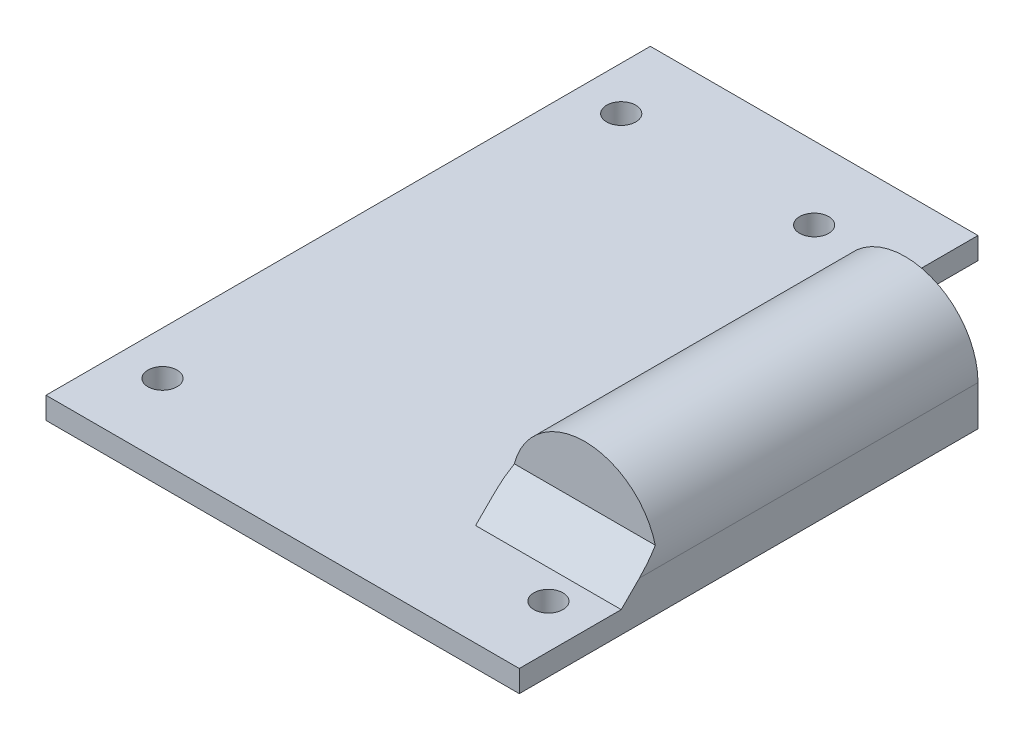
ISO-10303-21;
HEADER;
FILE_DESCRIPTION(('STEP AP214'),'2;1');
FILE_NAME('part.step','',(''),(''),'','','');
FILE_SCHEMA(('AUTOMOTIVE_DESIGN { 1 0 10303 214 1 1 1 1 }'));
ENDSEC;
DATA;
#1=APPLICATION_CONTEXT('core data for automotive mechanical design processes');
#2=APPLICATION_PROTOCOL_DEFINITION('international standard','automotive_design',2000,#1);
#3=PRODUCT_CONTEXT('',#1,'mechanical');
#4=PRODUCT('Part','Part','',(#3));
#5=PRODUCT_RELATED_PRODUCT_CATEGORY('part','',(#4));
#6=PRODUCT_DEFINITION_FORMATION('','',#4);
#7=PRODUCT_DEFINITION_CONTEXT('part definition',#1,'design');
#8=PRODUCT_DEFINITION('design','',#6,#7);
#9=PRODUCT_DEFINITION_SHAPE('','',#8);
#10=(LENGTH_UNIT() NAMED_UNIT(*) SI_UNIT(.MILLI.,.METRE.));
#11=(NAMED_UNIT(*) PLANE_ANGLE_UNIT() SI_UNIT($,.RADIAN.));
#12=(NAMED_UNIT(*) SI_UNIT($,.STERADIAN.) SOLID_ANGLE_UNIT());
#13=UNCERTAINTY_MEASURE_WITH_UNIT(LENGTH_MEASURE(1.E-05),#10,'distance_accuracy_value','');
#14=(GEOMETRIC_REPRESENTATION_CONTEXT(3) GLOBAL_UNCERTAINTY_ASSIGNED_CONTEXT((#13)) GLOBAL_UNIT_ASSIGNED_CONTEXT((#10,
#11,#12)) REPRESENTATION_CONTEXT('',''));
#15=CARTESIAN_POINT('',(0.,0.,0.));
#16=DIRECTION('',(0.,0.,1.));
#17=DIRECTION('',(1.,0.,0.));
#18=AXIS2_PLACEMENT_3D('',#15,#16,#17);
#19=CARTESIAN_POINT('',(55.,5.5,103.));
#20=DIRECTION('',(0.,0.,-1.));
#21=DIRECTION('',(1.,0.,0.));
#22=AXIS2_PLACEMENT_3D('',#19,#20,#21);
#23=CYLINDRICAL_SURFACE('',#22,4.05);
#24=DIRECTION('',(0.,0.,-1.));
#25=VECTOR('',#24,1.);
#26=CARTESIAN_POINT('',(59.05,5.5,112.790812019439));
#27=LINE('',#26,#25);
#28=CARTESIAN_POINT('',(59.05,5.5,103.));
#29=VERTEX_POINT('',#28);
#30=CARTESIAN_POINT('',(59.05,5.5,63.));
#31=VERTEX_POINT('',#30);
#32=EDGE_CURVE('E462',#29,#31,#27,.T.);
#33=ORIENTED_EDGE('',*,*,#32,.F.);
#34=CARTESIAN_POINT('',(55.,5.5,103.));
#35=DIRECTION('',(0.,0.,1.));
#36=DIRECTION('',(1.,0.,0.));
#37=AXIS2_PLACEMENT_3D('',#34,#35,#36);
#38=CIRCLE('',#37,4.05);
#39=CARTESIAN_POINT('',(50.95,5.5,103.));
#40=VERTEX_POINT('',#39);
#41=EDGE_CURVE('E152',#29,#40,#38,.T.);
#42=ORIENTED_EDGE('',*,*,#41,.T.);
#43=DIRECTION('',(0.,0.,-1.));
#44=VECTOR('',#43,1.);
#45=CARTESIAN_POINT('',(50.95,5.5,112.790812019439));
#46=LINE('',#45,#44);
#47=CARTESIAN_POINT('',(50.95,5.5,63.));
#48=VERTEX_POINT('',#47);
#49=EDGE_CURVE('E137',#40,#48,#46,.T.);
#50=ORIENTED_EDGE('',*,*,#49,.T.);
#51=CARTESIAN_POINT('',(55.,5.5,63.));
#52=DIRECTION('',(0.,0.,1.));
#53=DIRECTION('',(1.,0.,0.));
#54=AXIS2_PLACEMENT_3D('',#51,#52,#53);
#55=CIRCLE('',#54,4.05);
#56=EDGE_CURVE('E146',#31,#48,#55,.T.);
#57=ORIENTED_EDGE('',*,*,#56,.F.);
#58=EDGE_LOOP('',(#33,#42,#50,#57));
#59=FACE_BOUND('',#58,.T.);
#60=ADVANCED_FACE('F35',(#59),#23,.F.);
#61=CARTESIAN_POINT('',(0.,3.,126.));
#62=DIRECTION('',(1.,0.,0.));
#63=DIRECTION('',(0.,0.,1.));
#64=AXIS2_PLACEMENT_3D('',#61,#62,#63);
#65=PLANE('',#64);
#66=DIRECTION('',(0.,0.,-1.));
#67=VECTOR('',#66,1.);
#68=CARTESIAN_POINT('',(0.,0.,126.));
#69=LINE('',#68,#67);
#70=CARTESIAN_POINT('',(0.,0.,126.));
#71=VERTEX_POINT('',#70);
#72=CARTESIAN_POINT('',(0.,0.,43.));
#73=VERTEX_POINT('',#72);
#74=EDGE_CURVE('E208',#71,#73,#69,.T.);
#75=ORIENTED_EDGE('',*,*,#74,.F.);
#76=DIRECTION('',(0.,-1.,0.));
#77=VECTOR('',#76,1.);
#78=CARTESIAN_POINT('',(0.,3.,126.));
#79=LINE('',#78,#77);
#80=CARTESIAN_POINT('',(0.,3.,126.));
#81=VERTEX_POINT('',#80);
#82=EDGE_CURVE('E207',#81,#71,#79,.T.);
#83=ORIENTED_EDGE('',*,*,#82,.F.);
#84=DIRECTION('',(0.,0.,-1.));
#85=VECTOR('',#84,1.);
#86=CARTESIAN_POINT('',(0.,3.,126.));
#87=LINE('',#86,#85);
#88=CARTESIAN_POINT('',(0.,3.,43.));
#89=VERTEX_POINT('',#88);
#90=EDGE_CURVE('E192',#81,#89,#87,.T.);
#91=ORIENTED_EDGE('',*,*,#90,.T.);
#92=DIRECTION('',(0.,-1.,0.));
#93=VECTOR('',#92,1.);
#94=CARTESIAN_POINT('',(0.,3.,43.));
#95=LINE('',#94,#93);
#96=EDGE_CURVE('E238',#89,#73,#95,.T.);
#97=ORIENTED_EDGE('',*,*,#96,.T.);
#98=EDGE_LOOP('',(#75,#83,#91,#97));
#99=FACE_BOUND('',#98,.T.);
#100=ADVANCED_FACE('F290',(#99),#65,.F.);
#101=CARTESIAN_POINT('',(0.,3.,43.));
#102=DIRECTION('',(0.,0.,1.));
#103=DIRECTION('',(-1.,0.,0.));
#104=AXIS2_PLACEMENT_3D('',#101,#102,#103);
#105=PLANE('',#104);
#106=DIRECTION('',(1.,0.,0.));
#107=VECTOR('',#106,1.);
#108=CARTESIAN_POINT('',(0.,0.,43.));
#109=LINE('',#108,#107);
#110=CARTESIAN_POINT('',(45.,0.,43.));
#111=VERTEX_POINT('',#110);
#112=EDGE_CURVE('E211',#73,#111,#109,.T.);
#113=ORIENTED_EDGE('',*,*,#112,.F.);
#114=ORIENTED_EDGE('',*,*,#96,.F.);
#115=DIRECTION('',(1.,0.,0.));
#116=VECTOR('',#115,1.);
#117=CARTESIAN_POINT('',(0.,3.,43.));
#118=LINE('',#117,#116);
#119=CARTESIAN_POINT('',(45.,3.,43.));
#120=VERTEX_POINT('',#119);
#121=EDGE_CURVE('E195',#89,#120,#118,.T.);
#122=ORIENTED_EDGE('',*,*,#121,.T.);
#123=DIRECTION('',(0.,-1.,0.));
#124=VECTOR('',#123,1.);
#125=CARTESIAN_POINT('',(45.,3.,43.));
#126=LINE('',#125,#124);
#127=EDGE_CURVE('E235',#120,#111,#126,.T.);
#128=ORIENTED_EDGE('',*,*,#127,.T.);
#129=EDGE_LOOP('',(#113,#114,#122,#128));
#130=FACE_BOUND('',#129,.T.);
#131=ADVANCED_FACE('F294',(#130),#105,.F.);
#132=CARTESIAN_POINT('',(45.,3.,43.));
#133=DIRECTION('',(-1.,0.,0.));
#134=DIRECTION('',(0.,0.,-1.));
#135=AXIS2_PLACEMENT_3D('',#132,#133,#134);
#136=PLANE('',#135);
#137=DIRECTION('',(0.,0.,1.));
#138=VECTOR('',#137,1.);
#139=CARTESIAN_POINT('',(45.,0.,43.));
#140=LINE('',#139,#138);
#141=CARTESIAN_POINT('',(45.,0.,63.));
#142=VERTEX_POINT('',#141);
#143=EDGE_CURVE('E214',#111,#142,#140,.T.);
#144=ORIENTED_EDGE('',*,*,#143,.F.);
#145=ORIENTED_EDGE('',*,*,#127,.F.);
#146=DIRECTION('',(0.,0.,1.));
#147=VECTOR('',#146,1.);
#148=CARTESIAN_POINT('',(45.,3.,43.));
#149=LINE('',#148,#147);
#150=CARTESIAN_POINT('',(45.,3.,63.));
#151=VERTEX_POINT('',#150);
#152=EDGE_CURVE('E199',#120,#151,#149,.T.);
#153=ORIENTED_EDGE('',*,*,#152,.T.);
#154=DIRECTION('',(0.,-1.,0.));
#155=VECTOR('',#154,1.);
#156=CARTESIAN_POINT('',(45.,3.,63.));
#157=LINE('',#156,#155);
#158=EDGE_CURVE('E232',#151,#142,#157,.T.);
#159=ORIENTED_EDGE('',*,*,#158,.T.);
#160=EDGE_LOOP('',(#144,#145,#153,#159));
#161=FACE_BOUND('',#160,.T.);
#162=ADVANCED_FACE('F417',(#161),#136,.F.);
#163=CARTESIAN_POINT('',(45.,3.,63.));
#164=DIRECTION('',(0.,0.,1.));
#165=DIRECTION('',(-1.,0.,0.));
#166=AXIS2_PLACEMENT_3D('',#163,#164,#165);
#167=PLANE('',#166);
#168=ORIENTED_EDGE('',*,*,#56,.T.);
#169=DIRECTION('',(0.,-1.,0.));
#170=VECTOR('',#169,1.);
#171=CARTESIAN_POINT('',(50.95,5.5,63.));
#172=LINE('',#171,#170);
#173=CARTESIAN_POINT('',(50.95,0.,63.));
#174=VERTEX_POINT('',#173);
#175=EDGE_CURVE('E133',#48,#174,#172,.T.);
#176=ORIENTED_EDGE('',*,*,#175,.T.);
#177=DIRECTION('',(1.,0.,0.));
#178=VECTOR('',#177,1.);
#179=CARTESIAN_POINT('',(45.,0.,63.));
#180=LINE('',#179,#178);
#181=EDGE_CURVE('E218',#142,#174,#180,.T.);
#182=ORIENTED_EDGE('',*,*,#181,.F.);
#183=ORIENTED_EDGE('',*,*,#158,.F.);
#184=DIRECTION('',(0.,1.,0.));
#185=VECTOR('',#184,1.);
#186=CARTESIAN_POINT('',(45.,0.,63.));
#187=LINE('',#186,#185);
#188=CARTESIAN_POINT('',(45.,5.5,63.));
#189=VERTEX_POINT('',#188);
#190=EDGE_CURVE('E167',#151,#189,#187,.T.);
#191=ORIENTED_EDGE('',*,*,#190,.T.);
#192=CARTESIAN_POINT('',(55.,5.5,63.));
#193=DIRECTION('',(0.,0.,1.));
#194=DIRECTION('',(1.,0.,0.));
#195=AXIS2_PLACEMENT_3D('',#192,#193,#194);
#196=CIRCLE('',#195,9.99999999999999);
#197=CARTESIAN_POINT('',(65.,5.5,63.));
#198=VERTEX_POINT('',#197);
#199=EDGE_CURVE('E162',#189,#198,#196,.F.);
#200=ORIENTED_EDGE('',*,*,#199,.T.);
#201=DIRECTION('',(0.,-1.,0.));
#202=VECTOR('',#201,1.);
#203=CARTESIAN_POINT('',(65.,3.,63.));
#204=LINE('',#203,#202);
#205=CARTESIAN_POINT('',(65.,0.,63.));
#206=VERTEX_POINT('',#205);
#207=EDGE_CURVE('E229',#198,#206,#204,.T.);
#208=ORIENTED_EDGE('',*,*,#207,.T.);
#209=CARTESIAN_POINT('',(59.05,0.,63.));
#210=VERTEX_POINT('',#209);
#211=EDGE_CURVE('E217',#210,#206,#180,.T.);
#212=ORIENTED_EDGE('',*,*,#211,.F.);
#213=DIRECTION('',(0.,1.,0.));
#214=VECTOR('',#213,1.);
#215=CARTESIAN_POINT('',(59.05,0.,63.));
#216=LINE('',#215,#214);
#217=EDGE_CURVE('E143',#210,#31,#216,.T.);
#218=ORIENTED_EDGE('',*,*,#217,.T.);
#219=EDGE_LOOP('',(#168,#176,#182,#183,#191,#200,#208,#212,#218));
#220=FACE_BOUND('',#219,.T.);
#221=ADVANCED_FACE('F147',(#220),#167,.F.);
#222=CARTESIAN_POINT('',(65.,3.,126.));
#223=DIRECTION('',(-1.,0.,0.));
#224=DIRECTION('',(0.,0.,-1.));
#225=AXIS2_PLACEMENT_3D('',#222,#223,#224);
#226=PLANE('',#225);
#227=DIRECTION('',(0.,0.,1.));
#228=VECTOR('',#227,1.);
#229=CARTESIAN_POINT('',(65.,0.,126.));
#230=LINE('',#229,#228);
#231=CARTESIAN_POINT('',(65.,0.,126.));
#232=VERTEX_POINT('',#231);
#233=EDGE_CURVE('E220',#206,#232,#230,.T.);
#234=ORIENTED_EDGE('',*,*,#233,.F.);
#235=ORIENTED_EDGE('',*,*,#207,.F.);
#236=DIRECTION('',(0.,0.,-1.));
#237=VECTOR('',#236,1.);
#238=CARTESIAN_POINT('',(65.,5.5,107.));
#239=LINE('',#238,#237);
#240=CARTESIAN_POINT('',(65.,5.5,109.5));
#241=VERTEX_POINT('',#240);
#242=EDGE_CURVE('E172',#241,#198,#239,.T.);
#243=ORIENTED_EDGE('',*,*,#242,.F.);
#244=DIRECTION('',(0.,0.707106781186551,-0.707106781186544));
#245=VECTOR('',#244,1.);
#246=CARTESIAN_POINT('',(65.,-4.00000000000001,119.));
#247=LINE('',#246,#245);
#248=CARTESIAN_POINT('',(65.,3.,112.));
#249=VERTEX_POINT('',#248);
#250=EDGE_CURVE('E43',#249,#241,#247,.T.);
#251=ORIENTED_EDGE('',*,*,#250,.F.);
#252=DIRECTION('',(0.,0.,1.));
#253=VECTOR('',#252,1.);
#254=CARTESIAN_POINT('',(65.,3.,126.));
#255=LINE('',#254,#253);
#256=CARTESIAN_POINT('',(65.,3.,126.));
#257=VERTEX_POINT('',#256);
#258=EDGE_CURVE('E202',#249,#257,#255,.T.);
#259=ORIENTED_EDGE('',*,*,#258,.T.);
#260=DIRECTION('',(0.,-1.,0.));
#261=VECTOR('',#260,1.);
#262=CARTESIAN_POINT('',(65.,3.,126.));
#263=LINE('',#262,#261);
#264=EDGE_CURVE('E226',#257,#232,#263,.T.);
#265=ORIENTED_EDGE('',*,*,#264,.T.);
#266=EDGE_LOOP('',(#234,#235,#243,#251,#259,#265));
#267=FACE_BOUND('',#266,.T.);
#268=ADVANCED_FACE('F265',(#267),#226,.F.);
#269=CARTESIAN_POINT('',(0.,3.,126.));
#270=DIRECTION('',(0.,0.,-1.));
#271=DIRECTION('',(1.,0.,0.));
#272=AXIS2_PLACEMENT_3D('',#269,#270,#271);
#273=PLANE('',#272);
#274=DIRECTION('',(-1.,0.,0.));
#275=VECTOR('',#274,1.);
#276=CARTESIAN_POINT('',(0.,0.,126.));
#277=LINE('',#276,#275);
#278=EDGE_CURVE('E196',#232,#71,#277,.T.);
#279=ORIENTED_EDGE('',*,*,#278,.F.);
#280=ORIENTED_EDGE('',*,*,#264,.F.);
#281=DIRECTION('',(-1.,0.,0.));
#282=VECTOR('',#281,1.);
#283=CARTESIAN_POINT('',(0.,3.,126.));
#284=LINE('',#283,#282);
#285=EDGE_CURVE('E205',#257,#81,#284,.T.);
#286=ORIENTED_EDGE('',*,*,#285,.T.);
#287=ORIENTED_EDGE('',*,*,#82,.T.);
#288=EDGE_LOOP('',(#279,#280,#286,#287));
#289=FACE_BOUND('',#288,.T.);
#290=ADVANCED_FACE('F389',(#289),#273,.F.);
#291=CARTESIAN_POINT('',(0.,3.,126.));
#292=DIRECTION('',(0.,1.,0.));
#293=DIRECTION('',(0.,0.,-1.));
#294=AXIS2_PLACEMENT_3D('',#291,#292,#293);
#295=PLANE('',#294);
#296=DIRECTION('',(0.,0.,-1.));
#297=VECTOR('',#296,1.);
#298=CARTESIAN_POINT('',(45.,3.,107.));
#299=LINE('',#298,#297);
#300=CARTESIAN_POINT('',(45.,3.,112.));
#301=VERTEX_POINT('',#300);
#302=EDGE_CURVE('E175',#301,#151,#299,.T.);
#303=ORIENTED_EDGE('',*,*,#302,.T.);
#304=ORIENTED_EDGE('',*,*,#152,.F.);
#305=ORIENTED_EDGE('',*,*,#121,.F.);
#306=ORIENTED_EDGE('',*,*,#90,.F.);
#307=ORIENTED_EDGE('',*,*,#285,.F.);
#308=ORIENTED_EDGE('',*,*,#258,.F.);
#309=DIRECTION('',(1.,0.,0.));
#310=VECTOR('',#309,1.);
#311=CARTESIAN_POINT('',(0.,3.,112.));
#312=LINE('',#311,#310);
#313=EDGE_CURVE('E252',#301,#249,#312,.T.);
#314=ORIENTED_EDGE('',*,*,#313,.F.);
#315=EDGE_LOOP('',(#303,#304,#305,#306,#307,#308,#314));
#316=FACE_BOUND('',#315,.T.);
#317=CARTESIAN_POINT('',(59.,3.,116.));
#318=DIRECTION('',(0.,-1.,0.));
#319=DIRECTION('',(0.,0.,-1.));
#320=AXIS2_PLACEMENT_3D('',#317,#318,#319);
#321=CIRCLE('',#320,2.);
#322=CARTESIAN_POINT('',(59.,3.,114.));
#323=VERTEX_POINT('',#322);
#324=EDGE_CURVE('E178',#323,#323,#321,.T.);
#325=ORIENTED_EDGE('',*,*,#324,.T.);
#326=EDGE_LOOP('',(#325));
#327=FACE_BOUND('',#326,.T.);
#328=CARTESIAN_POINT('',(6.,3.,53.));
#329=DIRECTION('',(0.,-1.,0.));
#330=DIRECTION('',(0.,0.,-1.));
#331=AXIS2_PLACEMENT_3D('',#328,#329,#330);
#332=CIRCLE('',#331,2.);
#333=CARTESIAN_POINT('',(6.,3.,51.));
#334=VERTEX_POINT('',#333);
#335=EDGE_CURVE('E182',#334,#334,#332,.T.);
#336=ORIENTED_EDGE('',*,*,#335,.T.);
#337=EDGE_LOOP('',(#336));
#338=FACE_BOUND('',#337,.T.);
#339=CARTESIAN_POINT('',(32.5,3.,53.));
#340=DIRECTION('',(0.,-1.,0.));
#341=DIRECTION('',(0.,0.,-1.));
#342=AXIS2_PLACEMENT_3D('',#339,#340,#341);
#343=CIRCLE('',#342,2.);
#344=CARTESIAN_POINT('',(32.5,3.,51.));
#345=VERTEX_POINT('',#344);
#346=EDGE_CURVE('E174',#345,#345,#343,.T.);
#347=ORIENTED_EDGE('',*,*,#346,.T.);
#348=EDGE_LOOP('',(#347));
#349=FACE_BOUND('',#348,.T.);
#350=CARTESIAN_POINT('',(6.,3.,116.));
#351=DIRECTION('',(0.,-1.,0.));
#352=DIRECTION('',(0.,0.,-1.));
#353=AXIS2_PLACEMENT_3D('',#350,#351,#352);
#354=CIRCLE('',#353,2.);
#355=CARTESIAN_POINT('',(6.,3.,114.));
#356=VERTEX_POINT('',#355);
#357=EDGE_CURVE('E187',#356,#356,#354,.T.);
#358=ORIENTED_EDGE('',*,*,#357,.T.);
#359=EDGE_LOOP('',(#358));
#360=FACE_BOUND('',#359,.T.);
#361=ADVANCED_FACE('F379',(#316,#327,#338,#349,#360),#295,.T.);
#362=CARTESIAN_POINT('',(0.,0.,126.));
#363=DIRECTION('',(0.,1.,0.));
#364=DIRECTION('',(0.,0.,-1.));
#365=AXIS2_PLACEMENT_3D('',#362,#363,#364);
#366=PLANE('',#365);
#367=ORIENTED_EDGE('',*,*,#211,.T.);
#368=ORIENTED_EDGE('',*,*,#233,.T.);
#369=ORIENTED_EDGE('',*,*,#278,.T.);
#370=ORIENTED_EDGE('',*,*,#74,.T.);
#371=ORIENTED_EDGE('',*,*,#112,.T.);
#372=ORIENTED_EDGE('',*,*,#143,.T.);
#373=ORIENTED_EDGE('',*,*,#181,.T.);
#374=DIRECTION('',(0.,0.,-1.));
#375=VECTOR('',#374,1.);
#376=CARTESIAN_POINT('',(50.95,0.,112.790812019439));
#377=LINE('',#376,#375);
#378=CARTESIAN_POINT('',(50.95,0.,103.));
#379=VERTEX_POINT('',#378);
#380=EDGE_CURVE('E140',#379,#174,#377,.T.);
#381=ORIENTED_EDGE('',*,*,#380,.F.);
#382=DIRECTION('',(-1.,0.,0.));
#383=VECTOR('',#382,1.);
#384=CARTESIAN_POINT('',(50.95,0.,103.));
#385=LINE('',#384,#383);
#386=CARTESIAN_POINT('',(59.05,0.,103.));
#387=VERTEX_POINT('',#386);
#388=EDGE_CURVE('E461',#387,#379,#385,.T.);
#389=ORIENTED_EDGE('',*,*,#388,.F.);
#390=DIRECTION('',(0.,0.,-1.));
#391=VECTOR('',#390,1.);
#392=CARTESIAN_POINT('',(59.05,0.,112.790812019439));
#393=LINE('',#392,#391);
#394=EDGE_CURVE('E156',#387,#210,#393,.T.);
#395=ORIENTED_EDGE('',*,*,#394,.T.);
#396=EDGE_LOOP('',(#367,#368,#369,#370,#371,#372,#373,#381,#389,#395));
#397=FACE_BOUND('',#396,.T.);
#398=CARTESIAN_POINT('',(59.,0.,116.));
#399=DIRECTION('',(0.,-1.,0.));
#400=DIRECTION('',(0.,0.,-1.));
#401=AXIS2_PLACEMENT_3D('',#398,#399,#400);
#402=CIRCLE('',#401,2.);
#403=CARTESIAN_POINT('',(59.,0.,114.));
#404=VERTEX_POINT('',#403);
#405=EDGE_CURVE('E191',#404,#404,#402,.T.);
#406=ORIENTED_EDGE('',*,*,#405,.F.);
#407=EDGE_LOOP('',(#406));
#408=FACE_BOUND('',#407,.T.);
#409=CARTESIAN_POINT('',(6.,0.,53.));
#410=DIRECTION('',(0.,-1.,0.));
#411=DIRECTION('',(0.,0.,-1.));
#412=AXIS2_PLACEMENT_3D('',#409,#410,#411);
#413=CIRCLE('',#412,2.);
#414=CARTESIAN_POINT('',(6.,0.,51.));
#415=VERTEX_POINT('',#414);
#416=EDGE_CURVE('E246',#415,#415,#413,.T.);
#417=ORIENTED_EDGE('',*,*,#416,.F.);
#418=EDGE_LOOP('',(#417));
#419=FACE_BOUND('',#418,.T.);
#420=CARTESIAN_POINT('',(32.5,0.,53.));
#421=DIRECTION('',(0.,-1.,0.));
#422=DIRECTION('',(0.,0.,-1.));
#423=AXIS2_PLACEMENT_3D('',#420,#421,#422);
#424=CIRCLE('',#423,2.);
#425=CARTESIAN_POINT('',(32.5,0.,51.));
#426=VERTEX_POINT('',#425);
#427=EDGE_CURVE('E181',#426,#426,#424,.T.);
#428=ORIENTED_EDGE('',*,*,#427,.F.);
#429=EDGE_LOOP('',(#428));
#430=FACE_BOUND('',#429,.T.);
#431=CARTESIAN_POINT('',(6.,0.,116.));
#432=DIRECTION('',(0.,-1.,0.));
#433=DIRECTION('',(0.,0.,-1.));
#434=AXIS2_PLACEMENT_3D('',#431,#432,#433);
#435=CIRCLE('',#434,2.);
#436=CARTESIAN_POINT('',(6.,0.,114.));
#437=VERTEX_POINT('',#436);
#438=EDGE_CURVE('E190',#437,#437,#435,.T.);
#439=ORIENTED_EDGE('',*,*,#438,.F.);
#440=EDGE_LOOP('',(#439));
#441=FACE_BOUND('',#440,.T.);
#442=ADVANCED_FACE('F369',(#397,#408,#419,#430,#441),#366,.F.);
#443=CARTESIAN_POINT('',(6.,-2.,116.));
#444=DIRECTION('',(0.,1.,0.));
#445=DIRECTION('',(0.,0.,-1.));
#446=AXIS2_PLACEMENT_3D('',#443,#444,#445);
#447=CYLINDRICAL_SURFACE('',#446,2.);
#448=ORIENTED_EDGE('',*,*,#357,.F.);
#449=EDGE_LOOP('',(#448));
#450=FACE_BOUND('',#449,.T.);
#451=ORIENTED_EDGE('',*,*,#438,.T.);
#452=EDGE_LOOP('',(#451));
#453=FACE_BOUND('',#452,.T.);
#454=ADVANCED_FACE('F359',(#450,#453),#447,.F.);
#455=CARTESIAN_POINT('',(32.5,-2.,53.));
#456=DIRECTION('',(0.,1.,0.));
#457=DIRECTION('',(0.,0.,-1.));
#458=AXIS2_PLACEMENT_3D('',#455,#456,#457);
#459=CYLINDRICAL_SURFACE('',#458,2.);
#460=ORIENTED_EDGE('',*,*,#346,.F.);
#461=EDGE_LOOP('',(#460));
#462=FACE_BOUND('',#461,.T.);
#463=ORIENTED_EDGE('',*,*,#427,.T.);
#464=EDGE_LOOP('',(#463));
#465=FACE_BOUND('',#464,.T.);
#466=ADVANCED_FACE('F349',(#462,#465),#459,.F.);
#467=CARTESIAN_POINT('',(6.,-2.,53.));
#468=DIRECTION('',(0.,1.,0.));
#469=DIRECTION('',(0.,0.,-1.));
#470=AXIS2_PLACEMENT_3D('',#467,#468,#469);
#471=CYLINDRICAL_SURFACE('',#470,2.);
#472=ORIENTED_EDGE('',*,*,#335,.F.);
#473=EDGE_LOOP('',(#472));
#474=FACE_BOUND('',#473,.T.);
#475=ORIENTED_EDGE('',*,*,#416,.T.);
#476=EDGE_LOOP('',(#475));
#477=FACE_BOUND('',#476,.T.);
#478=ADVANCED_FACE('F339',(#474,#477),#471,.F.);
#479=CARTESIAN_POINT('',(59.,-2.,116.));
#480=DIRECTION('',(0.,1.,0.));
#481=DIRECTION('',(0.,0.,-1.));
#482=AXIS2_PLACEMENT_3D('',#479,#480,#481);
#483=CYLINDRICAL_SURFACE('',#482,2.);
#484=ORIENTED_EDGE('',*,*,#324,.F.);
#485=EDGE_LOOP('',(#484));
#486=FACE_BOUND('',#485,.T.);
#487=ORIENTED_EDGE('',*,*,#405,.T.);
#488=EDGE_LOOP('',(#487));
#489=FACE_BOUND('',#488,.T.);
#490=ADVANCED_FACE('F330',(#486,#489),#483,.F.);
#491=CARTESIAN_POINT('',(55.,5.5,107.));
#492=DIRECTION('',(0.,0.,-1.));
#493=DIRECTION('',(1.,0.,0.));
#494=AXIS2_PLACEMENT_3D('',#491,#492,#493);
#495=CYLINDRICAL_SURFACE('',#494,9.99999999999999);
#496=ORIENTED_EDGE('',*,*,#199,.F.);
#497=DIRECTION('',(0.,0.,-1.));
#498=VECTOR('',#497,1.);
#499=CARTESIAN_POINT('',(45.,5.5,107.));
#500=LINE('',#499,#498);
#501=CARTESIAN_POINT('',(45.,5.5,109.5));
#502=VERTEX_POINT('',#501);
#503=EDGE_CURVE('E166',#502,#189,#500,.T.);
#504=ORIENTED_EDGE('',*,*,#503,.F.);
#505=CARTESIAN_POINT('',(55.,5.5,109.5));
#506=DIRECTION('',(0.,0.707106781186544,0.707106781186551));
#507=DIRECTION('',(0.,0.707106781186551,-0.707106781186544));
#508=AXIS2_PLACEMENT_3D('',#505,#506,#507);
#509=ELLIPSE('',#508,14.1421356237309,9.99999999999999);
#510=CARTESIAN_POINT('',(45.3175416344815,8.00000000000004,107.));
#511=VERTEX_POINT('',#510);
#512=EDGE_CURVE('E254',#511,#502,#509,.T.);
#513=ORIENTED_EDGE('',*,*,#512,.F.);
#514=CARTESIAN_POINT('',(55.,5.5,107.));
#515=DIRECTION('',(0.,0.,1.));
#516=DIRECTION('',(1.,0.,0.));
#517=AXIS2_PLACEMENT_3D('',#514,#515,#516);
#518=CIRCLE('',#517,9.99999999999999);
#519=CARTESIAN_POINT('',(64.6824583655185,8.00000000000004,107.));
#520=VERTEX_POINT('',#519);
#521=EDGE_CURVE('E164',#511,#520,#518,.F.);
#522=ORIENTED_EDGE('',*,*,#521,.T.);
#523=CARTESIAN_POINT('',(55.,5.5,109.5));
#524=DIRECTION('',(0.,0.707106781186544,0.707106781186551));
#525=DIRECTION('',(0.,0.707106781186551,-0.707106781186544));
#526=AXIS2_PLACEMENT_3D('',#523,#524,#525);
#527=ELLIPSE('',#526,14.1421356237309,9.99999999999999);
#528=EDGE_CURVE('E11',#241,#520,#527,.T.);
#529=ORIENTED_EDGE('',*,*,#528,.F.);
#530=ORIENTED_EDGE('',*,*,#242,.T.);
#531=EDGE_LOOP('',(#496,#504,#513,#522,#529,#530));
#532=FACE_BOUND('',#531,.T.);
#533=ADVANCED_FACE('F267',(#532),#495,.T.);
#534=CARTESIAN_POINT('',(45.,0.,107.));
#535=DIRECTION('',(1.,0.,0.));
#536=DIRECTION('',(0.,0.,1.));
#537=AXIS2_PLACEMENT_3D('',#534,#535,#536);
#538=PLANE('',#537);
#539=ORIENTED_EDGE('',*,*,#190,.F.);
#540=ORIENTED_EDGE('',*,*,#302,.F.);
#541=DIRECTION('',(0.,-0.707106781186551,0.707106781186544));
#542=VECTOR('',#541,1.);
#543=CARTESIAN_POINT('',(45.,3.99999999999998,111.));
#544=LINE('',#543,#542);
#545=EDGE_CURVE('E257',#502,#301,#544,.T.);
#546=ORIENTED_EDGE('',*,*,#545,.F.);
#547=ORIENTED_EDGE('',*,*,#503,.T.);
#548=EDGE_LOOP('',(#539,#540,#546,#547));
#549=FACE_BOUND('',#548,.T.);
#550=ADVANCED_FACE('F274',(#549),#538,.F.);
#551=CARTESIAN_POINT('',(0.,0.,107.));
#552=DIRECTION('',(0.,0.,-1.));
#553=DIRECTION('',(1.,0.,0.));
#554=AXIS2_PLACEMENT_3D('',#551,#552,#553);
#555=PLANE('',#554);
#556=ORIENTED_EDGE('',*,*,#521,.F.);
#557=DIRECTION('',(-1.,0.,0.));
#558=VECTOR('',#557,1.);
#559=CARTESIAN_POINT('',(0.,8.00000000000004,107.));
#560=LINE('',#559,#558);
#561=EDGE_CURVE('E241',#520,#511,#560,.T.);
#562=ORIENTED_EDGE('',*,*,#561,.F.);
#563=EDGE_LOOP('',(#556,#562));
#564=FACE_BOUND('',#563,.T.);
#565=ADVANCED_FACE('F277',(#564),#555,.F.);
#566=CARTESIAN_POINT('',(55.,5.5,103.));
#567=DIRECTION('',(0.,0.,-1.));
#568=DIRECTION('',(1.,0.,0.));
#569=AXIS2_PLACEMENT_3D('',#566,#567,#568);
#570=PLANE('',#569);
#571=ORIENTED_EDGE('',*,*,#41,.F.);
#572=DIRECTION('',(0.,-1.,0.));
#573=VECTOR('',#572,1.);
#574=CARTESIAN_POINT('',(59.05,0.,103.));
#575=LINE('',#574,#573);
#576=EDGE_CURVE('E50',#29,#387,#575,.T.);
#577=ORIENTED_EDGE('',*,*,#576,.T.);
#578=ORIENTED_EDGE('',*,*,#388,.T.);
#579=DIRECTION('',(0.,1.,0.));
#580=VECTOR('',#579,1.);
#581=CARTESIAN_POINT('',(50.95,5.5,103.));
#582=LINE('',#581,#580);
#583=EDGE_CURVE('E153',#379,#40,#582,.T.);
#584=ORIENTED_EDGE('',*,*,#583,.T.);
#585=EDGE_LOOP('',(#571,#577,#578,#584));
#586=FACE_BOUND('',#585,.T.);
#587=ADVANCED_FACE('F279',(#586),#570,.T.);
#588=CARTESIAN_POINT('',(0.,8.00000000000004,107.));
#589=DIRECTION('',(0.,-0.707106781186544,-0.707106781186551));
#590=DIRECTION('',(-1.,0.,0.));
#591=AXIS2_PLACEMENT_3D('',#588,#589,#590);
#592=PLANE('',#591);
#593=ORIENTED_EDGE('',*,*,#250,.T.);
#594=ORIENTED_EDGE('',*,*,#528,.T.);
#595=ORIENTED_EDGE('',*,*,#561,.T.);
#596=ORIENTED_EDGE('',*,*,#512,.T.);
#597=ORIENTED_EDGE('',*,*,#545,.T.);
#598=ORIENTED_EDGE('',*,*,#313,.T.);
#599=EDGE_LOOP('',(#593,#594,#595,#596,#597,#598));
#600=FACE_BOUND('',#599,.T.);
#601=ADVANCED_FACE('F37',(#600),#592,.F.);
#602=CARTESIAN_POINT('',(59.05,0.,112.790812019439));
#603=DIRECTION('',(1.,0.,0.));
#604=DIRECTION('',(0.,0.,1.));
#605=AXIS2_PLACEMENT_3D('',#602,#603,#604);
#606=PLANE('',#605);
#607=ORIENTED_EDGE('',*,*,#576,.F.);
#608=ORIENTED_EDGE('',*,*,#32,.T.);
#609=ORIENTED_EDGE('',*,*,#217,.F.);
#610=ORIENTED_EDGE('',*,*,#394,.F.);
#611=EDGE_LOOP('',(#607,#608,#609,#610));
#612=FACE_BOUND('',#611,.T.);
#613=ADVANCED_FACE('F299',(#612),#606,.F.);
#614=CARTESIAN_POINT('',(50.95,5.5,112.790812019439));
#615=DIRECTION('',(-1.,0.,0.));
#616=DIRECTION('',(0.,0.,-1.));
#617=AXIS2_PLACEMENT_3D('',#614,#615,#616);
#618=PLANE('',#617);
#619=ORIENTED_EDGE('',*,*,#583,.F.);
#620=ORIENTED_EDGE('',*,*,#380,.T.);
#621=ORIENTED_EDGE('',*,*,#175,.F.);
#622=ORIENTED_EDGE('',*,*,#49,.F.);
#623=EDGE_LOOP('',(#619,#620,#621,#622));
#624=FACE_BOUND('',#623,.T.);
#625=ADVANCED_FACE('F135',(#624),#618,.F.);
#626=CLOSED_SHELL('',(#60,#100,#131,#162,#221,#268,#290,#361,#442,#454,#466,#478,#490,#533,#550,
#565,#587,#601,#613,#625));
#627=MANIFOLD_SOLID_BREP('B2',#626);
#628=ADVANCED_BREP_SHAPE_REPRESENTATION('',(#18,#627),#14);
#629=SHAPE_DEFINITION_REPRESENTATION(#9,#628);
ENDSEC;
END-ISO-10303-21;
